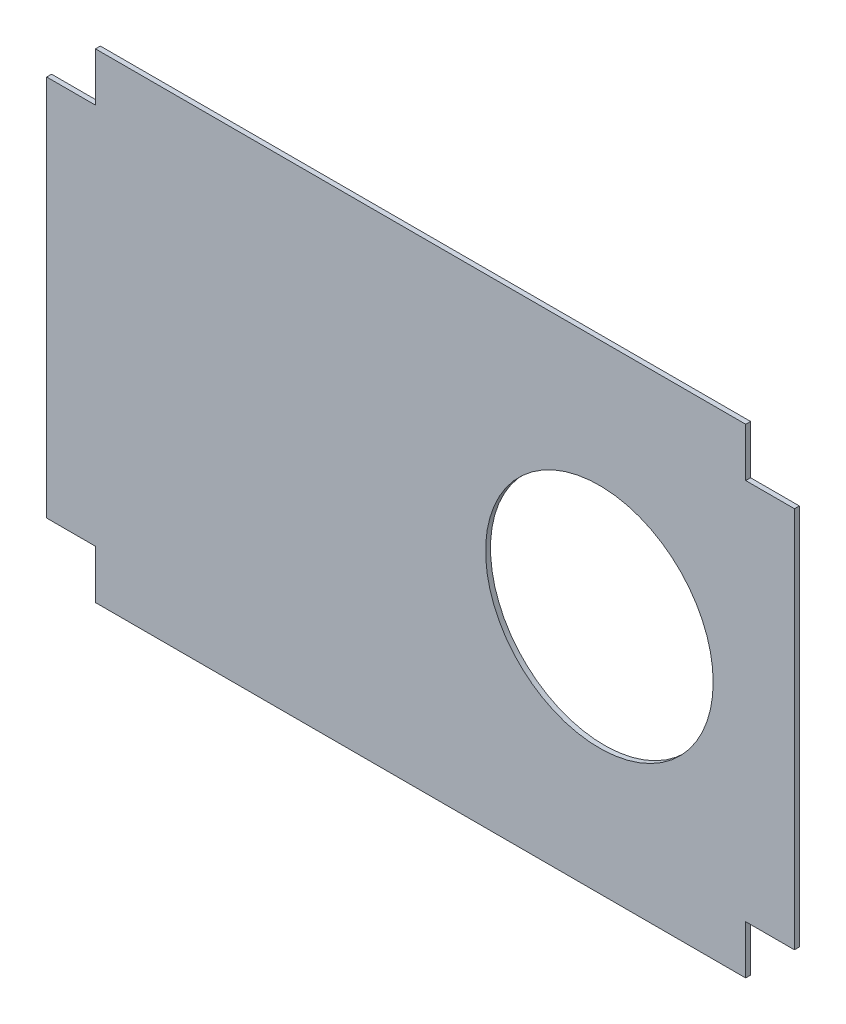
ISO-10303-21;
HEADER;
FILE_DESCRIPTION(('STEP AP214'),'2;1');
FILE_NAME('part.step','',(''),(''),'','','');
FILE_SCHEMA(('AUTOMOTIVE_DESIGN { 1 0 10303 214 1 1 1 1 }'));
ENDSEC;
DATA;
#1=APPLICATION_CONTEXT('core data for automotive mechanical design processes');
#2=APPLICATION_PROTOCOL_DEFINITION('international standard','automotive_design',2000,#1);
#3=PRODUCT_CONTEXT('',#1,'mechanical');
#4=PRODUCT('Part','Part','',(#3));
#5=PRODUCT_RELATED_PRODUCT_CATEGORY('part','',(#4));
#6=PRODUCT_DEFINITION_FORMATION('','',#4);
#7=PRODUCT_DEFINITION_CONTEXT('part definition',#1,'design');
#8=PRODUCT_DEFINITION('design','',#6,#7);
#9=PRODUCT_DEFINITION_SHAPE('','',#8);
#10=(LENGTH_UNIT() NAMED_UNIT(*) SI_UNIT(.MILLI.,.METRE.));
#11=(NAMED_UNIT(*) PLANE_ANGLE_UNIT() SI_UNIT($,.RADIAN.));
#12=(NAMED_UNIT(*) SI_UNIT($,.STERADIAN.) SOLID_ANGLE_UNIT());
#13=UNCERTAINTY_MEASURE_WITH_UNIT(LENGTH_MEASURE(1.E-05),#10,'distance_accuracy_value','');
#14=(GEOMETRIC_REPRESENTATION_CONTEXT(3) GLOBAL_UNCERTAINTY_ASSIGNED_CONTEXT((#13)) GLOBAL_UNIT_ASSIGNED_CONTEXT((#10,
#11,#12)) REPRESENTATION_CONTEXT('',''));
#15=CARTESIAN_POINT('',(0.,0.,0.));
#16=DIRECTION('',(0.,0.,1.));
#17=DIRECTION('',(1.,0.,0.));
#18=AXIS2_PLACEMENT_3D('',#15,#16,#17);
#19=CARTESIAN_POINT('',(0.,0.,3.));
#20=DIRECTION('',(0.,0.,1.));
#21=DIRECTION('',(1.,0.,0.));
#22=AXIS2_PLACEMENT_3D('',#19,#20,#21);
#23=PLANE('',#22);
#24=DIRECTION('',(-1.,0.,0.));
#25=VECTOR('',#24,1.);
#26=CARTESIAN_POINT('',(-290.816426189413,41.9961977186311,3.));
#27=LINE('',#26,#25);
#28=CARTESIAN_POINT('',(-260.816426189413,41.9961977186312,3.));
#29=VERTEX_POINT('',#28);
#30=CARTESIAN_POINT('',(-290.816426189413,41.9961977186311,3.));
#31=VERTEX_POINT('',#30);
#32=EDGE_CURVE('E177',#29,#31,#27,.T.);
#33=ORIENTED_EDGE('',*,*,#32,.T.);
#34=DIRECTION('',(0.,-1.,0.));
#35=VECTOR('',#34,1.);
#36=CARTESIAN_POINT('',(-290.816426189413,41.9961977186311,3.));
#37=LINE('',#36,#35);
#38=CARTESIAN_POINT('',(-290.816426189413,-193.003802281369,3.));
#39=VERTEX_POINT('',#38);
#40=EDGE_CURVE('E105',#31,#39,#37,.T.);
#41=ORIENTED_EDGE('',*,*,#40,.T.);
#42=DIRECTION('',(1.,0.,0.));
#43=VECTOR('',#42,1.);
#44=CARTESIAN_POINT('',(-260.816426189413,-193.003802281369,3.));
#45=LINE('',#44,#43);
#46=CARTESIAN_POINT('',(-260.816426189413,-193.003802281369,3.));
#47=VERTEX_POINT('',#46);
#48=EDGE_CURVE('E204',#39,#47,#45,.T.);
#49=ORIENTED_EDGE('',*,*,#48,.T.);
#50=DIRECTION('',(0.,-1.,0.));
#51=VECTOR('',#50,1.);
#52=CARTESIAN_POINT('',(-260.816426189413,-223.003802281369,3.));
#53=LINE('',#52,#51);
#54=CARTESIAN_POINT('',(-260.816426189413,-223.003802281369,3.));
#55=VERTEX_POINT('',#54);
#56=EDGE_CURVE('E223',#47,#55,#53,.T.);
#57=ORIENTED_EDGE('',*,*,#56,.T.);
#58=DIRECTION('',(1.,0.,0.));
#59=VECTOR('',#58,1.);
#60=CARTESIAN_POINT('',(139.183573810587,-223.003802281369,3.));
#61=LINE('',#60,#59);
#62=CARTESIAN_POINT('',(139.183573810587,-223.003802281369,3.));
#63=VERTEX_POINT('',#62);
#64=EDGE_CURVE('E220',#55,#63,#61,.T.);
#65=ORIENTED_EDGE('',*,*,#64,.T.);
#66=DIRECTION('',(0.,1.,0.));
#67=VECTOR('',#66,1.);
#68=CARTESIAN_POINT('',(139.183573810587,-193.003802281369,3.));
#69=LINE('',#68,#67);
#70=CARTESIAN_POINT('',(139.183573810587,-193.003802281369,3.));
#71=VERTEX_POINT('',#70);
#72=EDGE_CURVE('E222',#63,#71,#69,.T.);
#73=ORIENTED_EDGE('',*,*,#72,.T.);
#74=DIRECTION('',(1.,0.,0.));
#75=VECTOR('',#74,1.);
#76=CARTESIAN_POINT('',(169.183573810587,-193.003802281369,3.));
#77=LINE('',#76,#75);
#78=CARTESIAN_POINT('',(169.183573810587,-193.003802281369,3.));
#79=VERTEX_POINT('',#78);
#80=EDGE_CURVE('E225',#71,#79,#77,.T.);
#81=ORIENTED_EDGE('',*,*,#80,.T.);
#82=DIRECTION('',(0.,1.,0.));
#83=VECTOR('',#82,1.);
#84=CARTESIAN_POINT('',(169.183573810587,-193.003802281369,3.));
#85=LINE('',#84,#83);
#86=CARTESIAN_POINT('',(169.183573810587,41.9961977186312,3.));
#87=VERTEX_POINT('',#86);
#88=EDGE_CURVE('E231',#79,#87,#85,.T.);
#89=ORIENTED_EDGE('',*,*,#88,.T.);
#90=DIRECTION('',(-1.,0.,0.));
#91=VECTOR('',#90,1.);
#92=CARTESIAN_POINT('',(139.183573810587,41.9961977186312,3.));
#93=LINE('',#92,#91);
#94=CARTESIAN_POINT('',(139.183573810587,41.9961977186312,3.));
#95=VERTEX_POINT('',#94);
#96=EDGE_CURVE('E136',#87,#95,#93,.T.);
#97=ORIENTED_EDGE('',*,*,#96,.T.);
#98=DIRECTION('',(0.,1.,0.));
#99=VECTOR('',#98,1.);
#100=CARTESIAN_POINT('',(139.183573810587,71.9961977186312,3.));
#101=LINE('',#100,#99);
#102=CARTESIAN_POINT('',(139.183573810587,71.9961977186312,3.));
#103=VERTEX_POINT('',#102);
#104=EDGE_CURVE('E130',#95,#103,#101,.T.);
#105=ORIENTED_EDGE('',*,*,#104,.T.);
#106=DIRECTION('',(-1.,0.,0.));
#107=VECTOR('',#106,1.);
#108=CARTESIAN_POINT('',(-260.816426189413,71.9961977186312,3.));
#109=LINE('',#108,#107);
#110=CARTESIAN_POINT('',(-260.816426189413,71.9961977186312,3.));
#111=VERTEX_POINT('',#110);
#112=EDGE_CURVE('E134',#103,#111,#109,.T.);
#113=ORIENTED_EDGE('',*,*,#112,.T.);
#114=DIRECTION('',(0.,-1.,0.));
#115=VECTOR('',#114,1.);
#116=CARTESIAN_POINT('',(-260.816426189413,41.9961977186312,3.));
#117=LINE('',#116,#115);
#118=EDGE_CURVE('E50',#111,#29,#117,.T.);
#119=ORIENTED_EDGE('',*,*,#118,.T.);
#120=EDGE_LOOP('',(#33,#41,#49,#57,#65,#73,#81,#89,#97,#105,#113,#119));
#121=FACE_BOUND('',#120,.T.);
#122=CARTESIAN_POINT('',(49.1835738105871,-75.5038022813688,3.));
#123=DIRECTION('',(0.,0.,1.));
#124=DIRECTION('',(1.,0.,0.));
#125=AXIS2_PLACEMENT_3D('',#122,#123,#124);
#126=CIRCLE('',#125,70.);
#127=CARTESIAN_POINT('',(119.183573810587,-75.5038022813688,3.));
#128=VERTEX_POINT('',#127);
#129=EDGE_CURVE('E158',#128,#128,#126,.T.);
#130=ORIENTED_EDGE('',*,*,#129,.F.);
#131=EDGE_LOOP('',(#130));
#132=FACE_BOUND('',#131,.T.);
#133=ADVANCED_FACE('F33',(#121,#132),#23,.T.);
#134=CARTESIAN_POINT('',(0.,0.,0.));
#135=DIRECTION('',(0.,0.,1.));
#136=DIRECTION('',(1.,0.,0.));
#137=AXIS2_PLACEMENT_3D('',#134,#135,#136);
#138=PLANE('',#137);
#139=DIRECTION('',(-1.,0.,0.));
#140=VECTOR('',#139,1.);
#141=CARTESIAN_POINT('',(-290.816426189413,41.9961977186311,0.));
#142=LINE('',#141,#140);
#143=CARTESIAN_POINT('',(-260.816426189413,41.9961977186312,0.));
#144=VERTEX_POINT('',#143);
#145=CARTESIAN_POINT('',(-290.816426189413,41.9961977186311,0.));
#146=VERTEX_POINT('',#145);
#147=EDGE_CURVE('E154',#144,#146,#142,.T.);
#148=ORIENTED_EDGE('',*,*,#147,.F.);
#149=DIRECTION('',(0.,-1.,0.));
#150=VECTOR('',#149,1.);
#151=CARTESIAN_POINT('',(-260.816426189413,41.9961977186312,0.));
#152=LINE('',#151,#150);
#153=CARTESIAN_POINT('',(-260.816426189413,71.9961977186312,0.));
#154=VERTEX_POINT('',#153);
#155=EDGE_CURVE('E97',#154,#144,#152,.T.);
#156=ORIENTED_EDGE('',*,*,#155,.F.);
#157=DIRECTION('',(-1.,0.,0.));
#158=VECTOR('',#157,1.);
#159=CARTESIAN_POINT('',(-260.816426189413,71.9961977186312,0.));
#160=LINE('',#159,#158);
#161=CARTESIAN_POINT('',(139.183573810587,71.9961977186312,0.));
#162=VERTEX_POINT('',#161);
#163=EDGE_CURVE('E91',#162,#154,#160,.T.);
#164=ORIENTED_EDGE('',*,*,#163,.F.);
#165=DIRECTION('',(0.,1.,0.));
#166=VECTOR('',#165,1.);
#167=CARTESIAN_POINT('',(139.183573810587,71.9961977186312,0.));
#168=LINE('',#167,#166);
#169=CARTESIAN_POINT('',(139.183573810587,41.9961977186312,0.));
#170=VERTEX_POINT('',#169);
#171=EDGE_CURVE('E144',#170,#162,#168,.T.);
#172=ORIENTED_EDGE('',*,*,#171,.F.);
#173=DIRECTION('',(-1.,0.,0.));
#174=VECTOR('',#173,1.);
#175=CARTESIAN_POINT('',(139.183573810587,41.9961977186312,0.));
#176=LINE('',#175,#174);
#177=CARTESIAN_POINT('',(169.183573810587,41.9961977186312,0.));
#178=VERTEX_POINT('',#177);
#179=EDGE_CURVE('E172',#178,#170,#176,.T.);
#180=ORIENTED_EDGE('',*,*,#179,.F.);
#181=DIRECTION('',(0.,1.,0.));
#182=VECTOR('',#181,1.);
#183=CARTESIAN_POINT('',(169.183573810587,-193.003802281369,0.));
#184=LINE('',#183,#182);
#185=CARTESIAN_POINT('',(169.183573810587,-193.003802281369,0.));
#186=VERTEX_POINT('',#185);
#187=EDGE_CURVE('E170',#186,#178,#184,.T.);
#188=ORIENTED_EDGE('',*,*,#187,.F.);
#189=DIRECTION('',(1.,0.,0.));
#190=VECTOR('',#189,1.);
#191=CARTESIAN_POINT('',(169.183573810587,-193.003802281369,0.));
#192=LINE('',#191,#190);
#193=CARTESIAN_POINT('',(139.183573810587,-193.003802281369,0.));
#194=VERTEX_POINT('',#193);
#195=EDGE_CURVE('E168',#194,#186,#192,.T.);
#196=ORIENTED_EDGE('',*,*,#195,.F.);
#197=DIRECTION('',(0.,1.,0.));
#198=VECTOR('',#197,1.);
#199=CARTESIAN_POINT('',(139.183573810587,-193.003802281369,0.));
#200=LINE('',#199,#198);
#201=CARTESIAN_POINT('',(139.183573810587,-223.003802281369,0.));
#202=VERTEX_POINT('',#201);
#203=EDGE_CURVE('E166',#202,#194,#200,.T.);
#204=ORIENTED_EDGE('',*,*,#203,.F.);
#205=DIRECTION('',(1.,0.,0.));
#206=VECTOR('',#205,1.);
#207=CARTESIAN_POINT('',(139.183573810587,-223.003802281369,0.));
#208=LINE('',#207,#206);
#209=CARTESIAN_POINT('',(-260.816426189413,-223.003802281369,0.));
#210=VERTEX_POINT('',#209);
#211=EDGE_CURVE('E164',#210,#202,#208,.T.);
#212=ORIENTED_EDGE('',*,*,#211,.F.);
#213=DIRECTION('',(0.,-1.,0.));
#214=VECTOR('',#213,1.);
#215=CARTESIAN_POINT('',(-260.816426189413,-223.003802281369,0.));
#216=LINE('',#215,#214);
#217=CARTESIAN_POINT('',(-260.816426189413,-193.003802281369,0.));
#218=VERTEX_POINT('',#217);
#219=EDGE_CURVE('E162',#218,#210,#216,.T.);
#220=ORIENTED_EDGE('',*,*,#219,.F.);
#221=DIRECTION('',(1.,0.,0.));
#222=VECTOR('',#221,1.);
#223=CARTESIAN_POINT('',(-260.816426189413,-193.003802281369,0.));
#224=LINE('',#223,#222);
#225=CARTESIAN_POINT('',(-290.816426189413,-193.003802281369,0.));
#226=VERTEX_POINT('',#225);
#227=EDGE_CURVE('E160',#226,#218,#224,.T.);
#228=ORIENTED_EDGE('',*,*,#227,.F.);
#229=DIRECTION('',(0.,-1.,0.));
#230=VECTOR('',#229,1.);
#231=CARTESIAN_POINT('',(-290.816426189413,41.9961977186311,0.));
#232=LINE('',#231,#230);
#233=EDGE_CURVE('E157',#146,#226,#232,.T.);
#234=ORIENTED_EDGE('',*,*,#233,.F.);
#235=EDGE_LOOP('',(#148,#156,#164,#172,#180,#188,#196,#204,#212,#220,#228,#234));
#236=FACE_BOUND('',#235,.T.);
#237=CARTESIAN_POINT('',(49.1835738105871,-75.5038022813688,0.));
#238=DIRECTION('',(0.,0.,1.));
#239=DIRECTION('',(1.,0.,0.));
#240=AXIS2_PLACEMENT_3D('',#237,#238,#239);
#241=CIRCLE('',#240,70.);
#242=CARTESIAN_POINT('',(119.183573810587,-75.5038022813688,0.));
#243=VERTEX_POINT('',#242);
#244=EDGE_CURVE('E378',#243,#243,#241,.T.);
#245=ORIENTED_EDGE('',*,*,#244,.T.);
#246=EDGE_LOOP('',(#245));
#247=FACE_BOUND('',#246,.T.);
#248=ADVANCED_FACE('F208',(#236,#247),#138,.F.);
#249=CARTESIAN_POINT('',(-290.816426189413,41.9961977186311,3.));
#250=DIRECTION('',(0.,-1.,0.));
#251=DIRECTION('',(1.,0.,0.));
#252=AXIS2_PLACEMENT_3D('',#249,#250,#251);
#253=PLANE('',#252);
#254=ORIENTED_EDGE('',*,*,#147,.T.);
#255=DIRECTION('',(0.,0.,-1.));
#256=VECTOR('',#255,1.);
#257=CARTESIAN_POINT('',(-290.816426189413,41.9961977186311,3.));
#258=LINE('',#257,#256);
#259=EDGE_CURVE('E11',#31,#146,#258,.T.);
#260=ORIENTED_EDGE('',*,*,#259,.F.);
#261=ORIENTED_EDGE('',*,*,#32,.F.);
#262=DIRECTION('',(0.,0.,-1.));
#263=VECTOR('',#262,1.);
#264=CARTESIAN_POINT('',(-260.816426189413,41.9961977186312,3.));
#265=LINE('',#264,#263);
#266=EDGE_CURVE('E150',#29,#144,#265,.T.);
#267=ORIENTED_EDGE('',*,*,#266,.T.);
#268=EDGE_LOOP('',(#254,#260,#261,#267));
#269=FACE_BOUND('',#268,.T.);
#270=ADVANCED_FACE('F35',(#269),#253,.F.);
#271=CARTESIAN_POINT('',(-290.816426189413,41.9961977186311,3.));
#272=DIRECTION('',(1.,0.,0.));
#273=DIRECTION('',(0.,1.,0.));
#274=AXIS2_PLACEMENT_3D('',#271,#272,#273);
#275=PLANE('',#274);
#276=ORIENTED_EDGE('',*,*,#233,.T.);
#277=DIRECTION('',(0.,0.,-1.));
#278=VECTOR('',#277,1.);
#279=CARTESIAN_POINT('',(-290.816426189413,-193.003802281369,3.));
#280=LINE('',#279,#278);
#281=EDGE_CURVE('E42',#39,#226,#280,.T.);
#282=ORIENTED_EDGE('',*,*,#281,.F.);
#283=ORIENTED_EDGE('',*,*,#40,.F.);
#284=ORIENTED_EDGE('',*,*,#259,.T.);
#285=EDGE_LOOP('',(#276,#282,#283,#284));
#286=FACE_BOUND('',#285,.T.);
#287=ADVANCED_FACE('F265',(#286),#275,.F.);
#288=CARTESIAN_POINT('',(-260.816426189413,-193.003802281369,3.));
#289=DIRECTION('',(0.,1.,0.));
#290=DIRECTION('',(0.,0.,1.));
#291=AXIS2_PLACEMENT_3D('',#288,#289,#290);
#292=PLANE('',#291);
#293=ORIENTED_EDGE('',*,*,#227,.T.);
#294=DIRECTION('',(0.,0.,-1.));
#295=VECTOR('',#294,1.);
#296=CARTESIAN_POINT('',(-260.816426189413,-193.003802281369,3.));
#297=LINE('',#296,#295);
#298=EDGE_CURVE('E196',#47,#218,#297,.T.);
#299=ORIENTED_EDGE('',*,*,#298,.F.);
#300=ORIENTED_EDGE('',*,*,#48,.F.);
#301=ORIENTED_EDGE('',*,*,#281,.T.);
#302=EDGE_LOOP('',(#293,#299,#300,#301));
#303=FACE_BOUND('',#302,.T.);
#304=ADVANCED_FACE('F202',(#303),#292,.F.);
#305=CARTESIAN_POINT('',(-260.816426189413,-223.003802281369,3.));
#306=DIRECTION('',(1.,0.,0.));
#307=DIRECTION('',(0.,0.,-1.));
#308=AXIS2_PLACEMENT_3D('',#305,#306,#307);
#309=PLANE('',#308);
#310=ORIENTED_EDGE('',*,*,#219,.T.);
#311=DIRECTION('',(0.,0.,-1.));
#312=VECTOR('',#311,1.);
#313=CARTESIAN_POINT('',(-260.816426189413,-223.003802281369,3.));
#314=LINE('',#313,#312);
#315=EDGE_CURVE('E193',#55,#210,#314,.T.);
#316=ORIENTED_EDGE('',*,*,#315,.F.);
#317=ORIENTED_EDGE('',*,*,#56,.F.);
#318=ORIENTED_EDGE('',*,*,#298,.T.);
#319=EDGE_LOOP('',(#310,#316,#317,#318));
#320=FACE_BOUND('',#319,.T.);
#321=ADVANCED_FACE('F214',(#320),#309,.F.);
#322=CARTESIAN_POINT('',(139.183573810587,-223.003802281369,3.));
#323=DIRECTION('',(0.,1.,0.));
#324=DIRECTION('',(-1.,0.,0.));
#325=AXIS2_PLACEMENT_3D('',#322,#323,#324);
#326=PLANE('',#325);
#327=ORIENTED_EDGE('',*,*,#211,.T.);
#328=DIRECTION('',(0.,0.,-1.));
#329=VECTOR('',#328,1.);
#330=CARTESIAN_POINT('',(139.183573810587,-223.003802281369,3.));
#331=LINE('',#330,#329);
#332=EDGE_CURVE('E190',#63,#202,#331,.T.);
#333=ORIENTED_EDGE('',*,*,#332,.F.);
#334=ORIENTED_EDGE('',*,*,#64,.F.);
#335=ORIENTED_EDGE('',*,*,#315,.T.);
#336=EDGE_LOOP('',(#327,#333,#334,#335));
#337=FACE_BOUND('',#336,.T.);
#338=ADVANCED_FACE('F218',(#337),#326,.F.);
#339=CARTESIAN_POINT('',(139.183573810587,-193.003802281369,3.));
#340=DIRECTION('',(-1.,0.,0.));
#341=DIRECTION('',(0.,0.,1.));
#342=AXIS2_PLACEMENT_3D('',#339,#340,#341);
#343=PLANE('',#342);
#344=ORIENTED_EDGE('',*,*,#203,.T.);
#345=DIRECTION('',(0.,0.,-1.));
#346=VECTOR('',#345,1.);
#347=CARTESIAN_POINT('',(139.183573810587,-193.003802281369,3.));
#348=LINE('',#347,#346);
#349=EDGE_CURVE('E187',#71,#194,#348,.T.);
#350=ORIENTED_EDGE('',*,*,#349,.F.);
#351=ORIENTED_EDGE('',*,*,#72,.F.);
#352=ORIENTED_EDGE('',*,*,#332,.T.);
#353=EDGE_LOOP('',(#344,#350,#351,#352));
#354=FACE_BOUND('',#353,.T.);
#355=ADVANCED_FACE('F278',(#354),#343,.F.);
#356=CARTESIAN_POINT('',(169.183573810587,-193.003802281369,3.));
#357=DIRECTION('',(0.,1.,0.));
#358=DIRECTION('',(-1.,0.,0.));
#359=AXIS2_PLACEMENT_3D('',#356,#357,#358);
#360=PLANE('',#359);
#361=ORIENTED_EDGE('',*,*,#195,.T.);
#362=DIRECTION('',(0.,0.,-1.));
#363=VECTOR('',#362,1.);
#364=CARTESIAN_POINT('',(169.183573810587,-193.003802281369,3.));
#365=LINE('',#364,#363);
#366=EDGE_CURVE('E184',#79,#186,#365,.T.);
#367=ORIENTED_EDGE('',*,*,#366,.F.);
#368=ORIENTED_EDGE('',*,*,#80,.F.);
#369=ORIENTED_EDGE('',*,*,#349,.T.);
#370=EDGE_LOOP('',(#361,#367,#368,#369));
#371=FACE_BOUND('',#370,.T.);
#372=ADVANCED_FACE('F281',(#371),#360,.F.);
#373=CARTESIAN_POINT('',(169.183573810587,-193.003802281369,3.));
#374=DIRECTION('',(-1.,0.,0.));
#375=DIRECTION('',(0.,-1.,0.));
#376=AXIS2_PLACEMENT_3D('',#373,#374,#375);
#377=PLANE('',#376);
#378=ORIENTED_EDGE('',*,*,#187,.T.);
#379=DIRECTION('',(0.,0.,-1.));
#380=VECTOR('',#379,1.);
#381=CARTESIAN_POINT('',(169.183573810587,41.9961977186312,3.));
#382=LINE('',#381,#380);
#383=EDGE_CURVE('E181',#87,#178,#382,.T.);
#384=ORIENTED_EDGE('',*,*,#383,.F.);
#385=ORIENTED_EDGE('',*,*,#88,.F.);
#386=ORIENTED_EDGE('',*,*,#366,.T.);
#387=EDGE_LOOP('',(#378,#384,#385,#386));
#388=FACE_BOUND('',#387,.T.);
#389=ADVANCED_FACE('F237',(#388),#377,.F.);
#390=CARTESIAN_POINT('',(139.183573810587,41.9961977186312,3.));
#391=DIRECTION('',(0.,-1.,0.));
#392=DIRECTION('',(1.,0.,0.));
#393=AXIS2_PLACEMENT_3D('',#390,#391,#392);
#394=PLANE('',#393);
#395=ORIENTED_EDGE('',*,*,#179,.T.);
#396=DIRECTION('',(0.,0.,-1.));
#397=VECTOR('',#396,1.);
#398=CARTESIAN_POINT('',(139.183573810587,41.9961977186312,3.));
#399=LINE('',#398,#397);
#400=EDGE_CURVE('E145',#95,#170,#399,.T.);
#401=ORIENTED_EDGE('',*,*,#400,.F.);
#402=ORIENTED_EDGE('',*,*,#96,.F.);
#403=ORIENTED_EDGE('',*,*,#383,.T.);
#404=EDGE_LOOP('',(#395,#401,#402,#403));
#405=FACE_BOUND('',#404,.T.);
#406=ADVANCED_FACE('F241',(#405),#394,.F.);
#407=CARTESIAN_POINT('',(139.183573810587,71.9961977186312,3.));
#408=DIRECTION('',(-1.,0.,0.));
#409=DIRECTION('',(0.,0.,1.));
#410=AXIS2_PLACEMENT_3D('',#407,#408,#409);
#411=PLANE('',#410);
#412=ORIENTED_EDGE('',*,*,#171,.T.);
#413=DIRECTION('',(0.,0.,-1.));
#414=VECTOR('',#413,1.);
#415=CARTESIAN_POINT('',(139.183573810587,71.9961977186312,3.));
#416=LINE('',#415,#414);
#417=EDGE_CURVE('E141',#103,#162,#416,.T.);
#418=ORIENTED_EDGE('',*,*,#417,.F.);
#419=ORIENTED_EDGE('',*,*,#104,.F.);
#420=ORIENTED_EDGE('',*,*,#400,.T.);
#421=EDGE_LOOP('',(#412,#418,#419,#420));
#422=FACE_BOUND('',#421,.T.);
#423=ADVANCED_FACE('F142',(#422),#411,.F.);
#424=CARTESIAN_POINT('',(-260.816426189413,71.9961977186312,3.));
#425=DIRECTION('',(0.,-1.,0.));
#426=DIRECTION('',(0.,0.,-1.));
#427=AXIS2_PLACEMENT_3D('',#424,#425,#426);
#428=PLANE('',#427);
#429=ORIENTED_EDGE('',*,*,#163,.T.);
#430=DIRECTION('',(0.,0.,-1.));
#431=VECTOR('',#430,1.);
#432=CARTESIAN_POINT('',(-260.816426189413,71.9961977186312,3.));
#433=LINE('',#432,#431);
#434=EDGE_CURVE('E146',#111,#154,#433,.T.);
#435=ORIENTED_EDGE('',*,*,#434,.F.);
#436=ORIENTED_EDGE('',*,*,#112,.F.);
#437=ORIENTED_EDGE('',*,*,#417,.T.);
#438=EDGE_LOOP('',(#429,#435,#436,#437));
#439=FACE_BOUND('',#438,.T.);
#440=ADVANCED_FACE('F148',(#439),#428,.F.);
#441=CARTESIAN_POINT('',(-260.816426189413,41.9961977186312,3.));
#442=DIRECTION('',(1.,0.,0.));
#443=DIRECTION('',(0.,0.,-1.));
#444=AXIS2_PLACEMENT_3D('',#441,#442,#443);
#445=PLANE('',#444);
#446=ORIENTED_EDGE('',*,*,#155,.T.);
#447=ORIENTED_EDGE('',*,*,#266,.F.);
#448=ORIENTED_EDGE('',*,*,#118,.F.);
#449=ORIENTED_EDGE('',*,*,#434,.T.);
#450=EDGE_LOOP('',(#446,#447,#448,#449));
#451=FACE_BOUND('',#450,.T.);
#452=ADVANCED_FACE('F245',(#451),#445,.F.);
#453=CARTESIAN_POINT('',(49.1835738105871,-75.5038022813688,3.));
#454=DIRECTION('',(0.,0.,-1.));
#455=DIRECTION('',(-1.,0.,0.));
#456=AXIS2_PLACEMENT_3D('',#453,#454,#455);
#457=CYLINDRICAL_SURFACE('',#456,70.);
#458=ORIENTED_EDGE('',*,*,#129,.T.);
#459=EDGE_LOOP('',(#458));
#460=FACE_BOUND('',#459,.T.);
#461=ORIENTED_EDGE('',*,*,#244,.F.);
#462=EDGE_LOOP('',(#461));
#463=FACE_BOUND('',#462,.T.);
#464=ADVANCED_FACE('F247',(#460,#463),#457,.F.);
#465=CLOSED_SHELL('',(#133,#248,#270,#287,#304,#321,#338,#355,#372,#389,#406,#423,#440,#452,#464));
#466=MANIFOLD_SOLID_BREP('B2',#465);
#467=ADVANCED_BREP_SHAPE_REPRESENTATION('',(#18,#466),#14);
#468=SHAPE_DEFINITION_REPRESENTATION(#9,#467);
ENDSEC;
END-ISO-10303-21;
